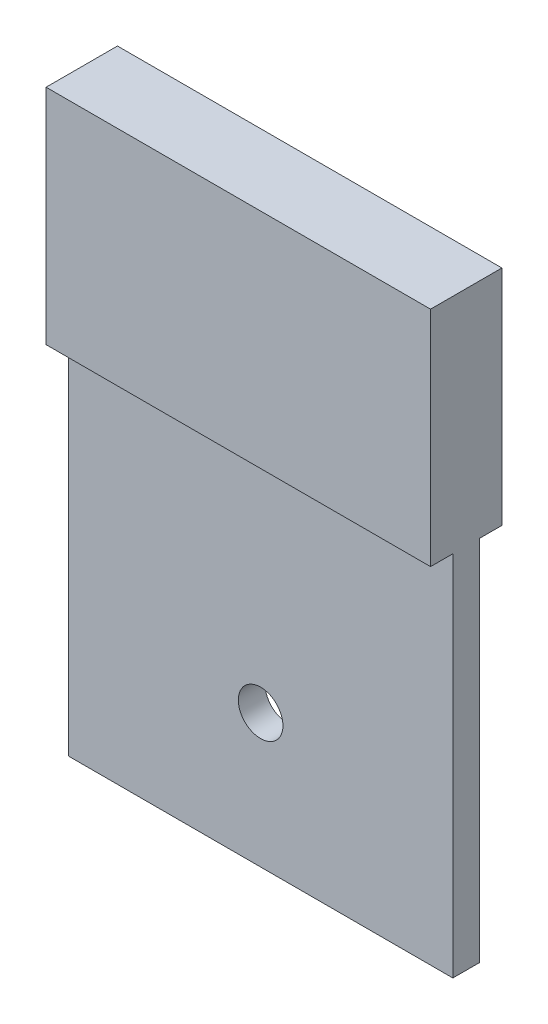
ISO-10303-21;
HEADER;
FILE_DESCRIPTION(('STEP AP214'),'2;1');
FILE_NAME('part.step','',(''),(''),'','','');
FILE_SCHEMA(('AUTOMOTIVE_DESIGN { 1 0 10303 214 1 1 1 1 }'));
ENDSEC;
DATA;
#1=APPLICATION_CONTEXT('core data for automotive mechanical design processes');
#2=APPLICATION_PROTOCOL_DEFINITION('international standard','automotive_design',2000,#1);
#3=PRODUCT_CONTEXT('',#1,'mechanical');
#4=PRODUCT('Part','Part','',(#3));
#5=PRODUCT_RELATED_PRODUCT_CATEGORY('part','',(#4));
#6=PRODUCT_DEFINITION_FORMATION('','',#4);
#7=PRODUCT_DEFINITION_CONTEXT('part definition',#1,'design');
#8=PRODUCT_DEFINITION('design','',#6,#7);
#9=PRODUCT_DEFINITION_SHAPE('','',#8);
#10=(LENGTH_UNIT() NAMED_UNIT(*) SI_UNIT(.MILLI.,.METRE.));
#11=(NAMED_UNIT(*) PLANE_ANGLE_UNIT() SI_UNIT($,.RADIAN.));
#12=(NAMED_UNIT(*) SI_UNIT($,.STERADIAN.) SOLID_ANGLE_UNIT());
#13=UNCERTAINTY_MEASURE_WITH_UNIT(LENGTH_MEASURE(1.E-05),#10,'distance_accuracy_value','');
#14=(GEOMETRIC_REPRESENTATION_CONTEXT(3) GLOBAL_UNCERTAINTY_ASSIGNED_CONTEXT((#13)) GLOBAL_UNIT_ASSIGNED_CONTEXT((#10,
#11,#12)) REPRESENTATION_CONTEXT('',''));
#15=CARTESIAN_POINT('',(0.,0.,0.));
#16=DIRECTION('',(0.,0.,1.));
#17=DIRECTION('',(1.,0.,0.));
#18=AXIS2_PLACEMENT_3D('',#15,#16,#17);
#19=CARTESIAN_POINT('',(0.,0.,6.));
#20=DIRECTION('',(0.,0.,1.));
#21=DIRECTION('',(1.,0.,0.));
#22=AXIS2_PLACEMENT_3D('',#19,#20,#21);
#23=PLANE('',#22);
#24=DIRECTION('',(0.,-1.,0.));
#25=VECTOR('',#24,1.);
#26=CARTESIAN_POINT('',(-97.1612526766421,63.9317943351667,6.));
#27=LINE('',#26,#25);
#28=CARTESIAN_POINT('',(-97.1612526766421,63.9317943351667,6.));
#29=VERTEX_POINT('',#28);
#30=CARTESIAN_POINT('',(-97.1612526766421,-18.4501541623844,6.));
#31=VERTEX_POINT('',#30);
#32=EDGE_CURVE('E97',#29,#31,#27,.T.);
#33=ORIENTED_EDGE('',*,*,#32,.T.);
#34=DIRECTION('',(1.,0.,0.));
#35=VECTOR('',#34,1.);
#36=CARTESIAN_POINT('',(-97.1612526766421,-18.4501541623844,6.));
#37=LINE('',#36,#35);
#38=CARTESIAN_POINT('',(-10.959231156072,-18.4501541623844,6.));
#39=VERTEX_POINT('',#38);
#40=EDGE_CURVE('E86',#31,#39,#37,.T.);
#41=ORIENTED_EDGE('',*,*,#40,.T.);
#42=DIRECTION('',(0.,1.,0.));
#43=VECTOR('',#42,1.);
#44=CARTESIAN_POINT('',(-10.959231156072,63.9317943351667,6.));
#45=LINE('',#44,#43);
#46=CARTESIAN_POINT('',(-10.959231156072,63.9317943351667,6.));
#47=VERTEX_POINT('',#46);
#48=EDGE_CURVE('E96',#39,#47,#45,.T.);
#49=ORIENTED_EDGE('',*,*,#48,.T.);
#50=DIRECTION('',(-1.,0.,0.));
#51=VECTOR('',#50,1.);
#52=CARTESIAN_POINT('',(-97.1612526766421,63.9317943351667,6.));
#53=LINE('',#52,#51);
#54=EDGE_CURVE('E101',#47,#29,#53,.T.);
#55=ORIENTED_EDGE('',*,*,#54,.T.);
#56=EDGE_LOOP('',(#33,#41,#49,#55));
#57=FACE_BOUND('',#56,.T.);
#58=CARTESIAN_POINT('',(-54.060241916357,11.4829630800854,6.));
#59=DIRECTION('',(0.,0.,1.));
#60=DIRECTION('',(1.,0.,0.));
#61=AXIS2_PLACEMENT_3D('',#58,#59,#60);
#62=CIRCLE('',#61,5.);
#63=CARTESIAN_POINT('',(-49.060241916357,11.4829630800854,6.));
#64=VERTEX_POINT('',#63);
#65=EDGE_CURVE('E113',#64,#64,#62,.T.);
#66=ORIENTED_EDGE('',*,*,#65,.F.);
#67=EDGE_LOOP('',(#66));
#68=FACE_BOUND('',#67,.T.);
#69=ADVANCED_FACE('F39',(#57,#68),#23,.T.);
#70=CARTESIAN_POINT('',(0.,0.,0.));
#71=DIRECTION('',(0.,0.,1.));
#72=DIRECTION('',(1.,0.,0.));
#73=AXIS2_PLACEMENT_3D('',#70,#71,#72);
#74=PLANE('',#73);
#75=DIRECTION('',(0.,-1.,0.));
#76=VECTOR('',#75,1.);
#77=CARTESIAN_POINT('',(-97.1612526766421,63.9317943351667,0.));
#78=LINE('',#77,#76);
#79=CARTESIAN_POINT('',(-97.1612526766421,63.9317943351667,0.));
#80=VERTEX_POINT('',#79);
#81=CARTESIAN_POINT('',(-97.1612526766421,-18.4501541623844,0.));
#82=VERTEX_POINT('',#81);
#83=EDGE_CURVE('E107',#80,#82,#78,.T.);
#84=ORIENTED_EDGE('',*,*,#83,.F.);
#85=DIRECTION('',(-1.,0.,0.));
#86=VECTOR('',#85,1.);
#87=CARTESIAN_POINT('',(-97.1612526766421,63.9317943351667,0.));
#88=LINE('',#87,#86);
#89=CARTESIAN_POINT('',(-10.959231156072,63.9317943351667,0.));
#90=VERTEX_POINT('',#89);
#91=EDGE_CURVE('E104',#90,#80,#88,.T.);
#92=ORIENTED_EDGE('',*,*,#91,.F.);
#93=DIRECTION('',(0.,1.,0.));
#94=VECTOR('',#93,1.);
#95=CARTESIAN_POINT('',(-10.959231156072,63.9317943351667,0.));
#96=LINE('',#95,#94);
#97=CARTESIAN_POINT('',(-10.959231156072,-18.4501541623844,0.));
#98=VERTEX_POINT('',#97);
#99=EDGE_CURVE('E117',#98,#90,#96,.T.);
#100=ORIENTED_EDGE('',*,*,#99,.F.);
#101=DIRECTION('',(1.,0.,0.));
#102=VECTOR('',#101,1.);
#103=CARTESIAN_POINT('',(-97.1612526766421,-18.4501541623844,0.));
#104=LINE('',#103,#102);
#105=EDGE_CURVE('E70',#82,#98,#104,.T.);
#106=ORIENTED_EDGE('',*,*,#105,.F.);
#107=EDGE_LOOP('',(#84,#92,#100,#106));
#108=FACE_BOUND('',#107,.T.);
#109=CARTESIAN_POINT('',(-54.060241916357,11.4829630800854,0.));
#110=DIRECTION('',(0.,0.,1.));
#111=DIRECTION('',(1.,0.,0.));
#112=AXIS2_PLACEMENT_3D('',#109,#110,#111);
#113=CIRCLE('',#112,5.);
#114=CARTESIAN_POINT('',(-49.060241916357,11.4829630800854,0.));
#115=VERTEX_POINT('',#114);
#116=EDGE_CURVE('E120',#115,#115,#113,.T.);
#117=ORIENTED_EDGE('',*,*,#116,.T.);
#118=EDGE_LOOP('',(#117));
#119=FACE_BOUND('',#118,.T.);
#120=ADVANCED_FACE('F211',(#108,#119),#74,.F.);
#121=CARTESIAN_POINT('',(-97.1612526766421,63.9317943351667,6.));
#122=DIRECTION('',(1.,0.,0.));
#123=DIRECTION('',(0.,1.,0.));
#124=AXIS2_PLACEMENT_3D('',#121,#122,#123);
#125=PLANE('',#124);
#126=ORIENTED_EDGE('',*,*,#83,.T.);
#127=DIRECTION('',(0.,0.,-1.));
#128=VECTOR('',#127,1.);
#129=CARTESIAN_POINT('',(-97.1612526766421,-18.4501541623844,6.));
#130=LINE('',#129,#128);
#131=EDGE_CURVE('E11',#31,#82,#130,.T.);
#132=ORIENTED_EDGE('',*,*,#131,.F.);
#133=ORIENTED_EDGE('',*,*,#32,.F.);
#134=DIRECTION('',(0.,0.,1.));
#135=VECTOR('',#134,1.);
#136=CARTESIAN_POINT('',(-97.1612526766421,63.9317943351667,6.));
#137=LINE('',#136,#135);
#138=CARTESIAN_POINT('',(-97.1612526766421,63.9317943351667,11.));
#139=VERTEX_POINT('',#138);
#140=EDGE_CURVE('E57',#29,#139,#137,.T.);
#141=ORIENTED_EDGE('',*,*,#140,.T.);
#142=DIRECTION('',(0.,-1.,0.));
#143=VECTOR('',#142,1.);
#144=CARTESIAN_POINT('',(-97.1612526766421,113.931794335167,11.));
#145=LINE('',#144,#143);
#146=CARTESIAN_POINT('',(-97.1612526766421,113.931794335167,11.));
#147=VERTEX_POINT('',#146);
#148=EDGE_CURVE('E135',#147,#139,#145,.T.);
#149=ORIENTED_EDGE('',*,*,#148,.F.);
#150=DIRECTION('',(0.,0.,1.));
#151=VECTOR('',#150,1.);
#152=CARTESIAN_POINT('',(-97.1612526766421,113.931794335167,-4.99999999999999));
#153=LINE('',#152,#151);
#154=CARTESIAN_POINT('',(-97.1612526766421,113.931794335167,-4.99999999999999));
#155=VERTEX_POINT('',#154);
#156=EDGE_CURVE('E156',#155,#147,#153,.T.);
#157=ORIENTED_EDGE('',*,*,#156,.F.);
#158=DIRECTION('',(0.,-1.,0.));
#159=VECTOR('',#158,1.);
#160=CARTESIAN_POINT('',(-97.1612526766421,113.931794335167,-4.99999999999999));
#161=LINE('',#160,#159);
#162=CARTESIAN_POINT('',(-97.1612526766421,63.9317943351667,-4.99999999999999));
#163=VERTEX_POINT('',#162);
#164=EDGE_CURVE('E148',#155,#163,#161,.T.);
#165=ORIENTED_EDGE('',*,*,#164,.T.);
#166=EDGE_CURVE('E110',#163,#80,#137,.T.);
#167=ORIENTED_EDGE('',*,*,#166,.T.);
#168=EDGE_LOOP('',(#126,#132,#133,#141,#149,#157,#165,#167));
#169=FACE_BOUND('',#168,.T.);
#170=ADVANCED_FACE('F41',(#169),#125,.F.);
#171=CARTESIAN_POINT('',(-97.1612526766421,-18.4501541623844,6.));
#172=DIRECTION('',(0.,1.,0.));
#173=DIRECTION('',(-1.,0.,0.));
#174=AXIS2_PLACEMENT_3D('',#171,#172,#173);
#175=PLANE('',#174);
#176=ORIENTED_EDGE('',*,*,#105,.T.);
#177=DIRECTION('',(0.,0.,-1.));
#178=VECTOR('',#177,1.);
#179=CARTESIAN_POINT('',(-10.959231156072,-18.4501541623844,6.));
#180=LINE('',#179,#178);
#181=EDGE_CURVE('E49',#39,#98,#180,.T.);
#182=ORIENTED_EDGE('',*,*,#181,.F.);
#183=ORIENTED_EDGE('',*,*,#40,.F.);
#184=ORIENTED_EDGE('',*,*,#131,.T.);
#185=EDGE_LOOP('',(#176,#182,#183,#184));
#186=FACE_BOUND('',#185,.T.);
#187=ADVANCED_FACE('F88',(#186),#175,.F.);
#188=CARTESIAN_POINT('',(-10.959231156072,63.9317943351667,6.));
#189=DIRECTION('',(-1.,0.,0.));
#190=DIRECTION('',(0.,-1.,0.));
#191=AXIS2_PLACEMENT_3D('',#188,#189,#190);
#192=PLANE('',#191);
#193=ORIENTED_EDGE('',*,*,#99,.T.);
#194=DIRECTION('',(0.,0.,-1.));
#195=VECTOR('',#194,1.);
#196=CARTESIAN_POINT('',(-10.959231156072,63.9317943351667,11.));
#197=LINE('',#196,#195);
#198=CARTESIAN_POINT('',(-10.959231156072,63.9317943351667,-5.));
#199=VERTEX_POINT('',#198);
#200=EDGE_CURVE('E78',#90,#199,#197,.T.);
#201=ORIENTED_EDGE('',*,*,#200,.T.);
#202=DIRECTION('',(0.,-1.,0.));
#203=VECTOR('',#202,1.);
#204=CARTESIAN_POINT('',(-10.959231156072,113.931794335167,-5.));
#205=LINE('',#204,#203);
#206=CARTESIAN_POINT('',(-10.959231156072,113.931794335167,-5.));
#207=VERTEX_POINT('',#206);
#208=EDGE_CURVE('E144',#207,#199,#205,.T.);
#209=ORIENTED_EDGE('',*,*,#208,.F.);
#210=DIRECTION('',(0.,0.,-1.));
#211=VECTOR('',#210,1.);
#212=CARTESIAN_POINT('',(-10.959231156072,113.931794335167,11.));
#213=LINE('',#212,#211);
#214=CARTESIAN_POINT('',(-10.959231156072,113.931794335167,11.));
#215=VERTEX_POINT('',#214);
#216=EDGE_CURVE('E170',#215,#207,#213,.T.);
#217=ORIENTED_EDGE('',*,*,#216,.F.);
#218=DIRECTION('',(0.,-1.,0.));
#219=VECTOR('',#218,1.);
#220=CARTESIAN_POINT('',(-10.959231156072,113.931794335167,11.));
#221=LINE('',#220,#219);
#222=CARTESIAN_POINT('',(-10.959231156072,63.9317943351667,11.));
#223=VERTEX_POINT('',#222);
#224=EDGE_CURVE('E140',#215,#223,#221,.T.);
#225=ORIENTED_EDGE('',*,*,#224,.T.);
#226=EDGE_CURVE('E157',#223,#47,#197,.T.);
#227=ORIENTED_EDGE('',*,*,#226,.T.);
#228=ORIENTED_EDGE('',*,*,#48,.F.);
#229=ORIENTED_EDGE('',*,*,#181,.T.);
#230=EDGE_LOOP('',(#193,#201,#209,#217,#225,#227,#228,#229));
#231=FACE_BOUND('',#230,.T.);
#232=ADVANCED_FACE('F202',(#231),#192,.F.);
#233=CARTESIAN_POINT('',(-54.060241916357,11.4829630800854,6.));
#234=DIRECTION('',(0.,0.,-1.));
#235=DIRECTION('',(-1.,0.,0.));
#236=AXIS2_PLACEMENT_3D('',#233,#234,#235);
#237=CYLINDRICAL_SURFACE('',#236,5.);
#238=ORIENTED_EDGE('',*,*,#65,.T.);
#239=EDGE_LOOP('',(#238));
#240=FACE_BOUND('',#239,.T.);
#241=ORIENTED_EDGE('',*,*,#116,.F.);
#242=EDGE_LOOP('',(#241));
#243=FACE_BOUND('',#242,.T.);
#244=ADVANCED_FACE('F233',(#240,#243),#237,.F.);
#245=CARTESIAN_POINT('',(0.,63.9317943351667,0.));
#246=DIRECTION('',(0.,1.,0.));
#247=DIRECTION('',(-1.,0.,0.));
#248=AXIS2_PLACEMENT_3D('',#245,#246,#247);
#249=PLANE('',#248);
#250=ORIENTED_EDGE('',*,*,#200,.F.);
#251=ORIENTED_EDGE('',*,*,#91,.T.);
#252=ORIENTED_EDGE('',*,*,#166,.F.);
#253=DIRECTION('',(-1.,0.,0.));
#254=VECTOR('',#253,1.);
#255=CARTESIAN_POINT('',(-10.959231156072,63.9317943351667,-5.));
#256=LINE('',#255,#254);
#257=EDGE_CURVE('E152',#199,#163,#256,.T.);
#258=ORIENTED_EDGE('',*,*,#257,.F.);
#259=EDGE_LOOP('',(#250,#251,#252,#258));
#260=FACE_BOUND('',#259,.T.);
#261=ADVANCED_FACE('F210',(#260),#249,.F.);
#262=CARTESIAN_POINT('',(-97.1612526766421,113.931794335167,11.));
#263=DIRECTION('',(0.,0.,-1.));
#264=DIRECTION('',(-1.,0.,0.));
#265=AXIS2_PLACEMENT_3D('',#262,#263,#264);
#266=PLANE('',#265);
#267=DIRECTION('',(1.,0.,0.));
#268=VECTOR('',#267,1.);
#269=CARTESIAN_POINT('',(-97.1612526766421,63.9317943351667,11.));
#270=LINE('',#269,#268);
#271=EDGE_CURVE('E161',#139,#223,#270,.T.);
#272=ORIENTED_EDGE('',*,*,#271,.T.);
#273=ORIENTED_EDGE('',*,*,#224,.F.);
#274=DIRECTION('',(1.,0.,0.));
#275=VECTOR('',#274,1.);
#276=CARTESIAN_POINT('',(-97.1612526766421,113.931794335167,11.));
#277=LINE('',#276,#275);
#278=EDGE_CURVE('E174',#147,#215,#277,.T.);
#279=ORIENTED_EDGE('',*,*,#278,.F.);
#280=ORIENTED_EDGE('',*,*,#148,.T.);
#281=EDGE_LOOP('',(#272,#273,#279,#280));
#282=FACE_BOUND('',#281,.T.);
#283=ADVANCED_FACE('F195',(#282),#266,.F.);
#284=CARTESIAN_POINT('',(-10.959231156072,113.931794335167,-5.));
#285=DIRECTION('',(0.,0.,1.));
#286=DIRECTION('',(1.,0.,0.));
#287=AXIS2_PLACEMENT_3D('',#284,#285,#286);
#288=PLANE('',#287);
#289=ORIENTED_EDGE('',*,*,#257,.T.);
#290=ORIENTED_EDGE('',*,*,#164,.F.);
#291=DIRECTION('',(-1.,0.,0.));
#292=VECTOR('',#291,1.);
#293=CARTESIAN_POINT('',(-10.959231156072,113.931794335167,-5.));
#294=LINE('',#293,#292);
#295=EDGE_CURVE('E151',#207,#155,#294,.T.);
#296=ORIENTED_EDGE('',*,*,#295,.F.);
#297=ORIENTED_EDGE('',*,*,#208,.T.);
#298=EDGE_LOOP('',(#289,#290,#296,#297));
#299=FACE_BOUND('',#298,.T.);
#300=ADVANCED_FACE('F215',(#299),#288,.F.);
#301=CARTESIAN_POINT('',(0.,113.931794335167,0.));
#302=DIRECTION('',(0.,1.,0.));
#303=DIRECTION('',(-1.,0.,0.));
#304=AXIS2_PLACEMENT_3D('',#301,#302,#303);
#305=PLANE('',#304);
#306=ORIENTED_EDGE('',*,*,#156,.T.);
#307=ORIENTED_EDGE('',*,*,#278,.T.);
#308=ORIENTED_EDGE('',*,*,#216,.T.);
#309=ORIENTED_EDGE('',*,*,#295,.T.);
#310=EDGE_LOOP('',(#306,#307,#308,#309));
#311=FACE_BOUND('',#310,.T.);
#312=ADVANCED_FACE('F184',(#311),#305,.T.);
#313=ORIENTED_EDGE('',*,*,#54,.F.);
#314=ORIENTED_EDGE('',*,*,#226,.F.);
#315=ORIENTED_EDGE('',*,*,#271,.F.);
#316=ORIENTED_EDGE('',*,*,#140,.F.);
#317=EDGE_LOOP('',(#313,#314,#315,#316));
#318=FACE_BOUND('',#317,.T.);
#319=ADVANCED_FACE('F222',(#318),#249,.F.);
#320=CLOSED_SHELL('',(#69,#120,#170,#187,#232,#244,#261,#283,#300,#312,#319));
#321=MANIFOLD_SOLID_BREP('B2',#320);
#322=ADVANCED_BREP_SHAPE_REPRESENTATION('',(#18,#321),#14);
#323=SHAPE_DEFINITION_REPRESENTATION(#9,#322);
ENDSEC;
END-ISO-10303-21;
